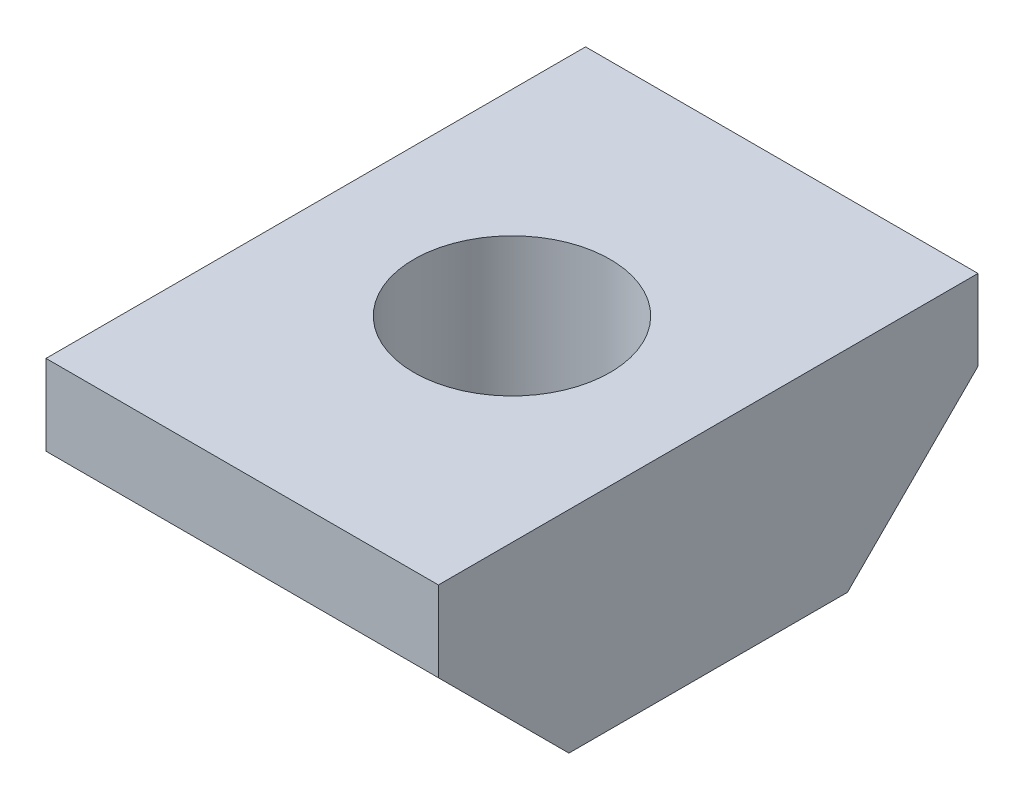
ISO-10303-21;
HEADER;
FILE_DESCRIPTION(('STEP AP214'),'2;1');
FILE_NAME('part.step','',(''),(''),'','','');
FILE_SCHEMA(('AUTOMOTIVE_DESIGN { 1 0 10303 214 1 1 1 1 }'));
ENDSEC;
DATA;
#1=APPLICATION_CONTEXT('core data for automotive mechanical design processes');
#2=APPLICATION_PROTOCOL_DEFINITION('international standard','automotive_design',2000,#1);
#3=PRODUCT_CONTEXT('',#1,'mechanical');
#4=PRODUCT('Part','Part','',(#3));
#5=PRODUCT_RELATED_PRODUCT_CATEGORY('part','',(#4));
#6=PRODUCT_DEFINITION_FORMATION('','',#4);
#7=PRODUCT_DEFINITION_CONTEXT('part definition',#1,'design');
#8=PRODUCT_DEFINITION('design','',#6,#7);
#9=PRODUCT_DEFINITION_SHAPE('','',#8);
#10=(LENGTH_UNIT() NAMED_UNIT(*) SI_UNIT(.MILLI.,.METRE.));
#11=(NAMED_UNIT(*) PLANE_ANGLE_UNIT() SI_UNIT($,.RADIAN.));
#12=(NAMED_UNIT(*) SI_UNIT($,.STERADIAN.) SOLID_ANGLE_UNIT());
#13=UNCERTAINTY_MEASURE_WITH_UNIT(LENGTH_MEASURE(1.E-05),#10,'distance_accuracy_value','');
#14=(GEOMETRIC_REPRESENTATION_CONTEXT(3) GLOBAL_UNCERTAINTY_ASSIGNED_CONTEXT((#13)) GLOBAL_UNIT_ASSIGNED_CONTEXT((#10,
#11,#12)) REPRESENTATION_CONTEXT('',''));
#15=CARTESIAN_POINT('',(0.,0.,0.));
#16=DIRECTION('',(0.,0.,1.));
#17=DIRECTION('',(1.,0.,0.));
#18=AXIS2_PLACEMENT_3D('',#15,#16,#17);
#19=CARTESIAN_POINT('',(8.,-1.63933982822114,5.5));
#20=DIRECTION('',(0.,0.707106781186672,-0.707106781186423));
#21=DIRECTION('',(0.,0.707106781186423,0.707106781186672));
#22=AXIS2_PLACEMENT_3D('',#19,#20,#21);
#23=PLANE('',#22);
#24=DIRECTION('',(0.,-0.707106781186423,-0.707106781186672));
#25=VECTOR('',#24,1.);
#26=CARTESIAN_POINT('',(0.,-1.63933982822114,5.5));
#27=LINE('',#26,#25);
#28=CARTESIAN_POINT('',(0.,-1.63933982822114,5.5));
#29=VERTEX_POINT('',#28);
#30=CARTESIAN_POINT('',(0.,-4.3,2.83933982822021));
#31=VERTEX_POINT('',#30);
#32=EDGE_CURVE('E117',#29,#31,#27,.T.);
#33=ORIENTED_EDGE('',*,*,#32,.T.);
#34=DIRECTION('',(-1.,0.,0.));
#35=VECTOR('',#34,1.);
#36=CARTESIAN_POINT('',(8.,-4.3,2.83933982822021));
#37=LINE('',#36,#35);
#38=CARTESIAN_POINT('',(8.,-4.3,2.83933982822021));
#39=VERTEX_POINT('',#38);
#40=EDGE_CURVE('E11',#39,#31,#37,.T.);
#41=ORIENTED_EDGE('',*,*,#40,.F.);
#42=DIRECTION('',(0.,-0.707106781186423,-0.707106781186672));
#43=VECTOR('',#42,1.);
#44=CARTESIAN_POINT('',(8.,-1.63933982822114,5.5));
#45=LINE('',#44,#43);
#46=CARTESIAN_POINT('',(8.,-1.63933982822114,5.5));
#47=VERTEX_POINT('',#46);
#48=EDGE_CURVE('E128',#47,#39,#45,.T.);
#49=ORIENTED_EDGE('',*,*,#48,.F.);
#50=DIRECTION('',(-1.,0.,0.));
#51=VECTOR('',#50,1.);
#52=CARTESIAN_POINT('',(8.,-1.63933982822114,5.5));
#53=LINE('',#52,#51);
#54=EDGE_CURVE('E113',#47,#29,#53,.T.);
#55=ORIENTED_EDGE('',*,*,#54,.T.);
#56=EDGE_LOOP('',(#33,#41,#49,#55));
#57=FACE_BOUND('',#56,.T.);
#58=ADVANCED_FACE('F33',(#57),#23,.F.);
#59=CARTESIAN_POINT('',(8.,-4.3,2.83933982822021));
#60=DIRECTION('',(0.,1.,0.));
#61=DIRECTION('',(0.,0.,1.));
#62=AXIS2_PLACEMENT_3D('',#59,#60,#61);
#63=PLANE('',#62);
#64=CARTESIAN_POINT('',(4.,-4.3,0.));
#65=DIRECTION('',(0.,1.,0.));
#66=DIRECTION('',(0.,0.,1.));
#67=AXIS2_PLACEMENT_3D('',#64,#65,#66);
#68=CIRCLE('',#67,2.);
#69=CARTESIAN_POINT('',(4.,-4.3,2.));
#70=VERTEX_POINT('',#69);
#71=EDGE_CURVE('E121',#70,#70,#68,.F.);
#72=ORIENTED_EDGE('',*,*,#71,.F.);
#73=EDGE_LOOP('',(#72));
#74=FACE_BOUND('',#73,.T.);
#75=DIRECTION('',(0.,0.,-1.));
#76=VECTOR('',#75,1.);
#77=CARTESIAN_POINT('',(0.,-4.3,2.83933982822021));
#78=LINE('',#77,#76);
#79=CARTESIAN_POINT('',(0.,-4.3,-2.83933982822021));
#80=VERTEX_POINT('',#79);
#81=EDGE_CURVE('E120',#31,#80,#78,.T.);
#82=ORIENTED_EDGE('',*,*,#81,.T.);
#83=DIRECTION('',(-1.,0.,0.));
#84=VECTOR('',#83,1.);
#85=CARTESIAN_POINT('',(8.,-4.3,-2.83933982822021));
#86=LINE('',#85,#84);
#87=CARTESIAN_POINT('',(8.,-4.3,-2.83933982822021));
#88=VERTEX_POINT('',#87);
#89=EDGE_CURVE('E41',#88,#80,#86,.T.);
#90=ORIENTED_EDGE('',*,*,#89,.F.);
#91=DIRECTION('',(0.,0.,-1.));
#92=VECTOR('',#91,1.);
#93=CARTESIAN_POINT('',(8.,-4.3,2.83933982822021));
#94=LINE('',#93,#92);
#95=EDGE_CURVE('E86',#39,#88,#94,.T.);
#96=ORIENTED_EDGE('',*,*,#95,.F.);
#97=ORIENTED_EDGE('',*,*,#40,.T.);
#98=EDGE_LOOP('',(#82,#90,#96,#97));
#99=FACE_BOUND('',#98,.T.);
#100=ADVANCED_FACE('F153',(#74,#99),#63,.F.);
#101=CARTESIAN_POINT('',(8.,-1.63933982822114,-5.5));
#102=DIRECTION('',(0.,0.707106781186672,0.707106781186423));
#103=DIRECTION('',(0.,-0.707106781186423,0.707106781186672));
#104=AXIS2_PLACEMENT_3D('',#101,#102,#103);
#105=PLANE('',#104);
#106=DIRECTION('',(0.,0.707106781186423,-0.707106781186672));
#107=VECTOR('',#106,1.);
#108=CARTESIAN_POINT('',(0.,-1.63933982822114,-5.5));
#109=LINE('',#108,#107);
#110=CARTESIAN_POINT('',(0.,-1.63933982822114,-5.5));
#111=VERTEX_POINT('',#110);
#112=EDGE_CURVE('E123',#80,#111,#109,.T.);
#113=ORIENTED_EDGE('',*,*,#112,.T.);
#114=DIRECTION('',(-1.,0.,0.));
#115=VECTOR('',#114,1.);
#116=CARTESIAN_POINT('',(8.,-1.63933982822114,-5.5));
#117=LINE('',#116,#115);
#118=CARTESIAN_POINT('',(8.,-1.63933982822114,-5.5));
#119=VERTEX_POINT('',#118);
#120=EDGE_CURVE('E108',#119,#111,#117,.T.);
#121=ORIENTED_EDGE('',*,*,#120,.F.);
#122=DIRECTION('',(0.,0.707106781186423,-0.707106781186672));
#123=VECTOR('',#122,1.);
#124=CARTESIAN_POINT('',(8.,-1.63933982822114,-5.5));
#125=LINE('',#124,#123);
#126=EDGE_CURVE('E99',#88,#119,#125,.T.);
#127=ORIENTED_EDGE('',*,*,#126,.F.);
#128=ORIENTED_EDGE('',*,*,#89,.T.);
#129=EDGE_LOOP('',(#113,#121,#127,#128));
#130=FACE_BOUND('',#129,.T.);
#131=ADVANCED_FACE('F134',(#130),#105,.F.);
#132=CARTESIAN_POINT('',(8.,0.,-5.5));
#133=DIRECTION('',(0.,0.,1.));
#134=DIRECTION('',(1.,0.,0.));
#135=AXIS2_PLACEMENT_3D('',#132,#133,#134);
#136=PLANE('',#135);
#137=DIRECTION('',(0.,1.,0.));
#138=VECTOR('',#137,1.);
#139=CARTESIAN_POINT('',(0.,0.,-5.5));
#140=LINE('',#139,#138);
#141=CARTESIAN_POINT('',(0.,0.,-5.5));
#142=VERTEX_POINT('',#141);
#143=EDGE_CURVE('E107',#111,#142,#140,.T.);
#144=ORIENTED_EDGE('',*,*,#143,.T.);
#145=DIRECTION('',(-1.,0.,0.));
#146=VECTOR('',#145,1.);
#147=CARTESIAN_POINT('',(8.,0.,-5.5));
#148=LINE('',#147,#146);
#149=CARTESIAN_POINT('',(8.,0.,-5.5));
#150=VERTEX_POINT('',#149);
#151=EDGE_CURVE('E104',#150,#142,#148,.T.);
#152=ORIENTED_EDGE('',*,*,#151,.F.);
#153=DIRECTION('',(0.,1.,0.));
#154=VECTOR('',#153,1.);
#155=CARTESIAN_POINT('',(8.,0.,-5.5));
#156=LINE('',#155,#154);
#157=EDGE_CURVE('E93',#119,#150,#156,.T.);
#158=ORIENTED_EDGE('',*,*,#157,.F.);
#159=ORIENTED_EDGE('',*,*,#120,.T.);
#160=EDGE_LOOP('',(#144,#152,#158,#159));
#161=FACE_BOUND('',#160,.T.);
#162=ADVANCED_FACE('F105',(#161),#136,.F.);
#163=CARTESIAN_POINT('',(8.,0.,5.5));
#164=DIRECTION('',(0.,-1.,0.));
#165=DIRECTION('',(0.,0.,-1.));
#166=AXIS2_PLACEMENT_3D('',#163,#164,#165);
#167=PLANE('',#166);
#168=CARTESIAN_POINT('',(4.,0.,0.));
#169=DIRECTION('',(0.,1.,0.));
#170=DIRECTION('',(0.,0.,1.));
#171=AXIS2_PLACEMENT_3D('',#168,#169,#170);
#172=CIRCLE('',#171,2.);
#173=CARTESIAN_POINT('',(4.,0.,2.));
#174=VERTEX_POINT('',#173);
#175=EDGE_CURVE('E210',#174,#174,#172,.T.);
#176=ORIENTED_EDGE('',*,*,#175,.F.);
#177=EDGE_LOOP('',(#176));
#178=FACE_BOUND('',#177,.T.);
#179=DIRECTION('',(0.,0.,1.));
#180=VECTOR('',#179,1.);
#181=CARTESIAN_POINT('',(0.,0.,5.5));
#182=LINE('',#181,#180);
#183=CARTESIAN_POINT('',(0.,0.,5.5));
#184=VERTEX_POINT('',#183);
#185=EDGE_CURVE('E72',#142,#184,#182,.T.);
#186=ORIENTED_EDGE('',*,*,#185,.T.);
#187=DIRECTION('',(-1.,0.,0.));
#188=VECTOR('',#187,1.);
#189=CARTESIAN_POINT('',(8.,0.,5.5));
#190=LINE('',#189,#188);
#191=CARTESIAN_POINT('',(8.,0.,5.5));
#192=VERTEX_POINT('',#191);
#193=EDGE_CURVE('E109',#192,#184,#190,.T.);
#194=ORIENTED_EDGE('',*,*,#193,.F.);
#195=DIRECTION('',(0.,0.,1.));
#196=VECTOR('',#195,1.);
#197=CARTESIAN_POINT('',(8.,0.,5.5));
#198=LINE('',#197,#196);
#199=EDGE_CURVE('E97',#150,#192,#198,.T.);
#200=ORIENTED_EDGE('',*,*,#199,.F.);
#201=ORIENTED_EDGE('',*,*,#151,.T.);
#202=EDGE_LOOP('',(#186,#194,#200,#201));
#203=FACE_BOUND('',#202,.T.);
#204=ADVANCED_FACE('F111',(#178,#203),#167,.F.);
#205=CARTESIAN_POINT('',(8.,0.,5.5));
#206=DIRECTION('',(0.,0.,-1.));
#207=DIRECTION('',(-1.,0.,0.));
#208=AXIS2_PLACEMENT_3D('',#205,#206,#207);
#209=PLANE('',#208);
#210=DIRECTION('',(0.,-1.,0.));
#211=VECTOR('',#210,1.);
#212=CARTESIAN_POINT('',(0.,0.,5.5));
#213=LINE('',#212,#211);
#214=EDGE_CURVE('E78',#184,#29,#213,.T.);
#215=ORIENTED_EDGE('',*,*,#214,.T.);
#216=ORIENTED_EDGE('',*,*,#54,.F.);
#217=DIRECTION('',(0.,-1.,0.));
#218=VECTOR('',#217,1.);
#219=CARTESIAN_POINT('',(8.,0.,5.5));
#220=LINE('',#219,#218);
#221=EDGE_CURVE('E49',#192,#47,#220,.T.);
#222=ORIENTED_EDGE('',*,*,#221,.F.);
#223=ORIENTED_EDGE('',*,*,#193,.T.);
#224=EDGE_LOOP('',(#215,#216,#222,#223));
#225=FACE_BOUND('',#224,.T.);
#226=ADVANCED_FACE('F141',(#225),#209,.F.);
#227=CARTESIAN_POINT('',(8.,0.,0.));
#228=DIRECTION('',(-1.,0.,0.));
#229=DIRECTION('',(0.,0.,1.));
#230=AXIS2_PLACEMENT_3D('',#227,#228,#229);
#231=PLANE('',#230);
#232=ORIENTED_EDGE('',*,*,#48,.T.);
#233=ORIENTED_EDGE('',*,*,#95,.T.);
#234=ORIENTED_EDGE('',*,*,#126,.T.);
#235=ORIENTED_EDGE('',*,*,#157,.T.);
#236=ORIENTED_EDGE('',*,*,#199,.T.);
#237=ORIENTED_EDGE('',*,*,#221,.T.);
#238=EDGE_LOOP('',(#232,#233,#234,#235,#236,#237));
#239=FACE_BOUND('',#238,.T.);
#240=ADVANCED_FACE('F95',(#239),#231,.F.);
#241=CARTESIAN_POINT('',(0.,0.,0.));
#242=DIRECTION('',(-1.,0.,0.));
#243=DIRECTION('',(0.,0.,1.));
#244=AXIS2_PLACEMENT_3D('',#241,#242,#243);
#245=PLANE('',#244);
#246=ORIENTED_EDGE('',*,*,#32,.F.);
#247=ORIENTED_EDGE('',*,*,#214,.F.);
#248=ORIENTED_EDGE('',*,*,#185,.F.);
#249=ORIENTED_EDGE('',*,*,#143,.F.);
#250=ORIENTED_EDGE('',*,*,#112,.F.);
#251=ORIENTED_EDGE('',*,*,#81,.F.);
#252=EDGE_LOOP('',(#246,#247,#248,#249,#250,#251));
#253=FACE_BOUND('',#252,.T.);
#254=ADVANCED_FACE('F137',(#253),#245,.T.);
#255=CARTESIAN_POINT('',(4.,-9.95685424949238,0.));
#256=DIRECTION('',(0.,1.,0.));
#257=DIRECTION('',(0.,0.,1.));
#258=AXIS2_PLACEMENT_3D('',#255,#256,#257);
#259=CYLINDRICAL_SURFACE('',#258,2.);
#260=ORIENTED_EDGE('',*,*,#71,.T.);
#261=EDGE_LOOP('',(#260));
#262=FACE_BOUND('',#261,.T.);
#263=ORIENTED_EDGE('',*,*,#175,.T.);
#264=EDGE_LOOP('',(#263));
#265=FACE_BOUND('',#264,.T.);
#266=ADVANCED_FACE('F182',(#262,#265),#259,.F.);
#267=CLOSED_SHELL('',(#58,#100,#131,#162,#204,#226,#240,#254,#266));
#268=MANIFOLD_SOLID_BREP('B2',#267);
#269=ADVANCED_BREP_SHAPE_REPRESENTATION('',(#18,#268),#14);
#270=SHAPE_DEFINITION_REPRESENTATION(#9,#269);
ENDSEC;
END-ISO-10303-21;
